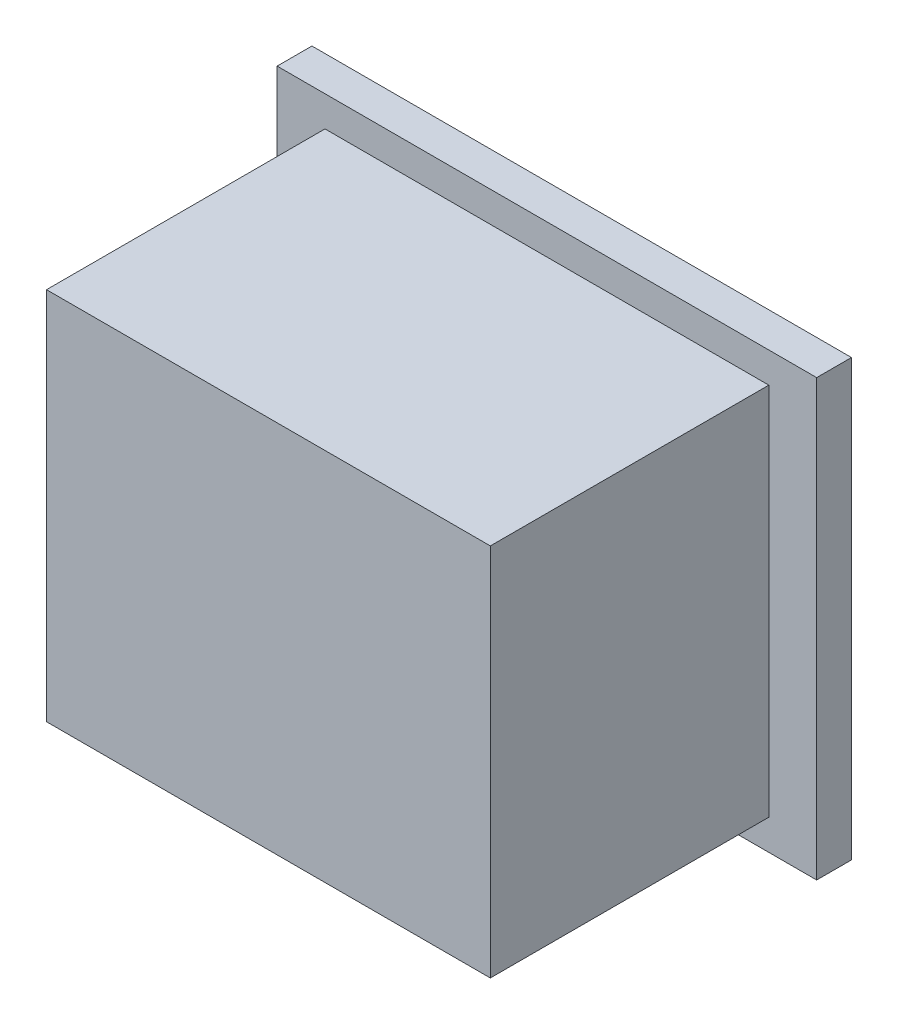
ISO-10303-21;
HEADER;
FILE_DESCRIPTION(('STEP AP214'),'2;1');
FILE_NAME('part.step','',(''),(''),'','','');
FILE_SCHEMA(('AUTOMOTIVE_DESIGN { 1 0 10303 214 1 1 1 1 }'));
ENDSEC;
DATA;
#1=APPLICATION_CONTEXT('core data for automotive mechanical design processes');
#2=APPLICATION_PROTOCOL_DEFINITION('international standard','automotive_design',2000,#1);
#3=PRODUCT_CONTEXT('',#1,'mechanical');
#4=PRODUCT('Part','Part','',(#3));
#5=PRODUCT_RELATED_PRODUCT_CATEGORY('part','',(#4));
#6=PRODUCT_DEFINITION_FORMATION('','',#4);
#7=PRODUCT_DEFINITION_CONTEXT('part definition',#1,'design');
#8=PRODUCT_DEFINITION('design','',#6,#7);
#9=PRODUCT_DEFINITION_SHAPE('','',#8);
#10=(LENGTH_UNIT() NAMED_UNIT(*) SI_UNIT(.MILLI.,.METRE.));
#11=(NAMED_UNIT(*) PLANE_ANGLE_UNIT() SI_UNIT($,.RADIAN.));
#12=(NAMED_UNIT(*) SI_UNIT($,.STERADIAN.) SOLID_ANGLE_UNIT());
#13=UNCERTAINTY_MEASURE_WITH_UNIT(LENGTH_MEASURE(1.E-05),#10,'distance_accuracy_value','');
#14=(GEOMETRIC_REPRESENTATION_CONTEXT(3) GLOBAL_UNCERTAINTY_ASSIGNED_CONTEXT((#13)) GLOBAL_UNIT_ASSIGNED_CONTEXT((#10,
#11,#12)) REPRESENTATION_CONTEXT('',''));
#15=CARTESIAN_POINT('',(0.,0.,0.));
#16=DIRECTION('',(0.,0.,1.));
#17=DIRECTION('',(1.,0.,0.));
#18=AXIS2_PLACEMENT_3D('',#15,#16,#17);
#19=CARTESIAN_POINT('',(-12.75,-10.75,16.));
#20=DIRECTION('',(1.,0.,0.));
#21=DIRECTION('',(0.,0.,-1.));
#22=AXIS2_PLACEMENT_3D('',#19,#20,#21);
#23=PLANE('',#22);
#24=DIRECTION('',(0.,-1.,0.));
#25=VECTOR('',#24,1.);
#26=CARTESIAN_POINT('',(-12.75,-10.75,0.));
#27=LINE('',#26,#25);
#28=CARTESIAN_POINT('',(-12.75,10.75,0.));
#29=VERTEX_POINT('',#28);
#30=CARTESIAN_POINT('',(-12.75,-10.75,0.));
#31=VERTEX_POINT('',#30);
#32=EDGE_CURVE('E118',#29,#31,#27,.T.);
#33=ORIENTED_EDGE('',*,*,#32,.T.);
#34=DIRECTION('',(0.,0.,-1.));
#35=VECTOR('',#34,1.);
#36=CARTESIAN_POINT('',(-12.75,-10.75,16.));
#37=LINE('',#36,#35);
#38=CARTESIAN_POINT('',(-12.75,-10.75,16.));
#39=VERTEX_POINT('',#38);
#40=EDGE_CURVE('E11',#39,#31,#37,.T.);
#41=ORIENTED_EDGE('',*,*,#40,.F.);
#42=DIRECTION('',(0.,-1.,0.));
#43=VECTOR('',#42,1.);
#44=CARTESIAN_POINT('',(-12.75,-10.75,16.));
#45=LINE('',#44,#43);
#46=CARTESIAN_POINT('',(-12.75,10.75,16.));
#47=VERTEX_POINT('',#46);
#48=EDGE_CURVE('E127',#47,#39,#45,.T.);
#49=ORIENTED_EDGE('',*,*,#48,.F.);
#50=DIRECTION('',(0.,0.,-1.));
#51=VECTOR('',#50,1.);
#52=CARTESIAN_POINT('',(-12.75,10.75,16.));
#53=LINE('',#52,#51);
#54=EDGE_CURVE('E134',#47,#29,#53,.T.);
#55=ORIENTED_EDGE('',*,*,#54,.T.);
#56=EDGE_LOOP('',(#33,#41,#49,#55));
#57=FACE_BOUND('',#56,.T.);
#58=ADVANCED_FACE('F33',(#57),#23,.F.);
#59=CARTESIAN_POINT('',(12.75,-10.75,16.));
#60=DIRECTION('',(0.,1.,0.));
#61=DIRECTION('',(-1.,0.,0.));
#62=AXIS2_PLACEMENT_3D('',#59,#60,#61);
#63=PLANE('',#62);
#64=DIRECTION('',(1.,0.,0.));
#65=VECTOR('',#64,1.);
#66=CARTESIAN_POINT('',(12.75,-10.75,0.));
#67=LINE('',#66,#65);
#68=CARTESIAN_POINT('',(12.75,-10.75,0.));
#69=VERTEX_POINT('',#68);
#70=EDGE_CURVE('E121',#31,#69,#67,.T.);
#71=ORIENTED_EDGE('',*,*,#70,.T.);
#72=DIRECTION('',(0.,0.,-1.));
#73=VECTOR('',#72,1.);
#74=CARTESIAN_POINT('',(12.75,-10.75,16.));
#75=LINE('',#74,#73);
#76=CARTESIAN_POINT('',(12.75,-10.75,16.));
#77=VERTEX_POINT('',#76);
#78=EDGE_CURVE('E41',#77,#69,#75,.T.);
#79=ORIENTED_EDGE('',*,*,#78,.F.);
#80=DIRECTION('',(1.,0.,0.));
#81=VECTOR('',#80,1.);
#82=CARTESIAN_POINT('',(12.75,-10.75,16.));
#83=LINE('',#82,#81);
#84=EDGE_CURVE('E129',#39,#77,#83,.T.);
#85=ORIENTED_EDGE('',*,*,#84,.F.);
#86=ORIENTED_EDGE('',*,*,#40,.T.);
#87=EDGE_LOOP('',(#71,#79,#85,#86));
#88=FACE_BOUND('',#87,.T.);
#89=ADVANCED_FACE('F155',(#88),#63,.F.);
#90=CARTESIAN_POINT('',(12.75,-10.75,16.));
#91=DIRECTION('',(-1.,0.,0.));
#92=DIRECTION('',(0.,0.,1.));
#93=AXIS2_PLACEMENT_3D('',#90,#91,#92);
#94=PLANE('',#93);
#95=DIRECTION('',(0.,1.,0.));
#96=VECTOR('',#95,1.);
#97=CARTESIAN_POINT('',(12.75,-10.75,0.));
#98=LINE('',#97,#96);
#99=CARTESIAN_POINT('',(12.75,10.75,0.));
#100=VERTEX_POINT('',#99);
#101=EDGE_CURVE('E138',#69,#100,#98,.T.);
#102=ORIENTED_EDGE('',*,*,#101,.T.);
#103=DIRECTION('',(0.,0.,-1.));
#104=VECTOR('',#103,1.);
#105=CARTESIAN_POINT('',(12.75,10.75,16.));
#106=LINE('',#105,#104);
#107=CARTESIAN_POINT('',(12.75,10.75,16.));
#108=VERTEX_POINT('',#107);
#109=EDGE_CURVE('E145',#108,#100,#106,.T.);
#110=ORIENTED_EDGE('',*,*,#109,.F.);
#111=DIRECTION('',(0.,1.,0.));
#112=VECTOR('',#111,1.);
#113=CARTESIAN_POINT('',(12.75,-10.75,16.));
#114=LINE('',#113,#112);
#115=EDGE_CURVE('E132',#77,#108,#114,.T.);
#116=ORIENTED_EDGE('',*,*,#115,.F.);
#117=ORIENTED_EDGE('',*,*,#78,.T.);
#118=EDGE_LOOP('',(#102,#110,#116,#117));
#119=FACE_BOUND('',#118,.T.);
#120=ADVANCED_FACE('F151',(#119),#94,.F.);
#121=CARTESIAN_POINT('',(12.75,10.75,16.));
#122=DIRECTION('',(0.,-1.,0.));
#123=DIRECTION('',(1.,0.,0.));
#124=AXIS2_PLACEMENT_3D('',#121,#122,#123);
#125=PLANE('',#124);
#126=DIRECTION('',(-1.,0.,0.));
#127=VECTOR('',#126,1.);
#128=CARTESIAN_POINT('',(12.75,10.75,0.));
#129=LINE('',#128,#127);
#130=EDGE_CURVE('E130',#100,#29,#129,.T.);
#131=ORIENTED_EDGE('',*,*,#130,.T.);
#132=ORIENTED_EDGE('',*,*,#54,.F.);
#133=DIRECTION('',(-1.,0.,0.));
#134=VECTOR('',#133,1.);
#135=CARTESIAN_POINT('',(12.75,10.75,16.));
#136=LINE('',#135,#134);
#137=EDGE_CURVE('E48',#108,#47,#136,.T.);
#138=ORIENTED_EDGE('',*,*,#137,.F.);
#139=ORIENTED_EDGE('',*,*,#109,.T.);
#140=EDGE_LOOP('',(#131,#132,#138,#139));
#141=FACE_BOUND('',#140,.T.);
#142=ADVANCED_FACE('F161',(#141),#125,.F.);
#143=CARTESIAN_POINT('',(0.,0.,16.));
#144=DIRECTION('',(0.,0.,1.));
#145=DIRECTION('',(1.,0.,0.));
#146=AXIS2_PLACEMENT_3D('',#143,#144,#145);
#147=PLANE('',#146);
#148=ORIENTED_EDGE('',*,*,#48,.T.);
#149=ORIENTED_EDGE('',*,*,#84,.T.);
#150=ORIENTED_EDGE('',*,*,#115,.T.);
#151=ORIENTED_EDGE('',*,*,#137,.T.);
#152=EDGE_LOOP('',(#148,#149,#150,#151));
#153=FACE_BOUND('',#152,.T.);
#154=ADVANCED_FACE('F164',(#153),#147,.T.);
#155=CARTESIAN_POINT('',(15.5,-12.5,-2.));
#156=DIRECTION('',(-1.,0.,0.));
#157=DIRECTION('',(0.,0.,1.));
#158=AXIS2_PLACEMENT_3D('',#155,#156,#157);
#159=PLANE('',#158);
#160=DIRECTION('',(0.,-1.,0.));
#161=VECTOR('',#160,1.);
#162=CARTESIAN_POINT('',(15.5,-12.5,0.));
#163=LINE('',#162,#161);
#164=CARTESIAN_POINT('',(15.5,12.5,0.));
#165=VERTEX_POINT('',#164);
#166=CARTESIAN_POINT('',(15.5,-12.5,0.));
#167=VERTEX_POINT('',#166);
#168=EDGE_CURVE('E117',#165,#167,#163,.T.);
#169=ORIENTED_EDGE('',*,*,#168,.T.);
#170=DIRECTION('',(0.,0.,1.));
#171=VECTOR('',#170,1.);
#172=CARTESIAN_POINT('',(15.5,-12.5,-2.));
#173=LINE('',#172,#171);
#174=CARTESIAN_POINT('',(15.5,-12.5,-2.));
#175=VERTEX_POINT('',#174);
#176=EDGE_CURVE('E97',#175,#167,#173,.T.);
#177=ORIENTED_EDGE('',*,*,#176,.F.);
#178=DIRECTION('',(0.,-1.,0.));
#179=VECTOR('',#178,1.);
#180=CARTESIAN_POINT('',(15.5,-12.5,-2.));
#181=LINE('',#180,#179);
#182=CARTESIAN_POINT('',(15.5,12.5,-2.));
#183=VERTEX_POINT('',#182);
#184=EDGE_CURVE('E104',#183,#175,#181,.T.);
#185=ORIENTED_EDGE('',*,*,#184,.F.);
#186=DIRECTION('',(0.,0.,1.));
#187=VECTOR('',#186,1.);
#188=CARTESIAN_POINT('',(15.5,12.5,-2.));
#189=LINE('',#188,#187);
#190=EDGE_CURVE('E244',#183,#165,#189,.T.);
#191=ORIENTED_EDGE('',*,*,#190,.T.);
#192=EDGE_LOOP('',(#169,#177,#185,#191));
#193=FACE_BOUND('',#192,.T.);
#194=ADVANCED_FACE('F115',(#193),#159,.F.);
#195=CARTESIAN_POINT('',(-15.5,-12.5,-2.));
#196=DIRECTION('',(0.,1.,0.));
#197=DIRECTION('',(-1.,0.,0.));
#198=AXIS2_PLACEMENT_3D('',#195,#196,#197);
#199=PLANE('',#198);
#200=DIRECTION('',(-1.,0.,0.));
#201=VECTOR('',#200,1.);
#202=CARTESIAN_POINT('',(-15.5,-12.5,0.));
#203=LINE('',#202,#201);
#204=CARTESIAN_POINT('',(-15.5,-12.5,0.));
#205=VERTEX_POINT('',#204);
#206=EDGE_CURVE('E250',#167,#205,#203,.T.);
#207=ORIENTED_EDGE('',*,*,#206,.T.);
#208=DIRECTION('',(0.,0.,1.));
#209=VECTOR('',#208,1.);
#210=CARTESIAN_POINT('',(-15.5,-12.5,-2.));
#211=LINE('',#210,#209);
#212=CARTESIAN_POINT('',(-15.5,-12.5,-2.));
#213=VERTEX_POINT('',#212);
#214=EDGE_CURVE('E100',#213,#205,#211,.T.);
#215=ORIENTED_EDGE('',*,*,#214,.F.);
#216=DIRECTION('',(-1.,0.,0.));
#217=VECTOR('',#216,1.);
#218=CARTESIAN_POINT('',(-15.5,-12.5,-2.));
#219=LINE('',#218,#217);
#220=EDGE_CURVE('E93',#175,#213,#219,.T.);
#221=ORIENTED_EDGE('',*,*,#220,.F.);
#222=ORIENTED_EDGE('',*,*,#176,.T.);
#223=EDGE_LOOP('',(#207,#215,#221,#222));
#224=FACE_BOUND('',#223,.T.);
#225=ADVANCED_FACE('F95',(#224),#199,.F.);
#226=CARTESIAN_POINT('',(-15.5,-12.5,-2.));
#227=DIRECTION('',(1.,0.,0.));
#228=DIRECTION('',(0.,1.,0.));
#229=AXIS2_PLACEMENT_3D('',#226,#227,#228);
#230=PLANE('',#229);
#231=DIRECTION('',(0.,1.,0.));
#232=VECTOR('',#231,1.);
#233=CARTESIAN_POINT('',(-15.5,-12.5,0.));
#234=LINE('',#233,#232);
#235=CARTESIAN_POINT('',(-15.5,12.5,0.));
#236=VERTEX_POINT('',#235);
#237=EDGE_CURVE('E247',#205,#236,#234,.T.);
#238=ORIENTED_EDGE('',*,*,#237,.T.);
#239=DIRECTION('',(0.,0.,1.));
#240=VECTOR('',#239,1.);
#241=CARTESIAN_POINT('',(-15.5,12.5,-2.));
#242=LINE('',#241,#240);
#243=CARTESIAN_POINT('',(-15.5,12.5,-2.));
#244=VERTEX_POINT('',#243);
#245=EDGE_CURVE('E123',#244,#236,#242,.T.);
#246=ORIENTED_EDGE('',*,*,#245,.F.);
#247=DIRECTION('',(0.,1.,0.));
#248=VECTOR('',#247,1.);
#249=CARTESIAN_POINT('',(-15.5,-12.5,-2.));
#250=LINE('',#249,#248);
#251=EDGE_CURVE('E103',#213,#244,#250,.T.);
#252=ORIENTED_EDGE('',*,*,#251,.F.);
#253=ORIENTED_EDGE('',*,*,#214,.T.);
#254=EDGE_LOOP('',(#238,#246,#252,#253));
#255=FACE_BOUND('',#254,.T.);
#256=ADVANCED_FACE('F203',(#255),#230,.F.);
#257=CARTESIAN_POINT('',(-15.5,12.5,-2.));
#258=DIRECTION('',(0.,-1.,0.));
#259=DIRECTION('',(1.,0.,0.));
#260=AXIS2_PLACEMENT_3D('',#257,#258,#259);
#261=PLANE('',#260);
#262=DIRECTION('',(1.,0.,0.));
#263=VECTOR('',#262,1.);
#264=CARTESIAN_POINT('',(-15.5,12.5,0.));
#265=LINE('',#264,#263);
#266=EDGE_CURVE('E113',#236,#165,#265,.T.);
#267=ORIENTED_EDGE('',*,*,#266,.T.);
#268=ORIENTED_EDGE('',*,*,#190,.F.);
#269=DIRECTION('',(1.,0.,0.));
#270=VECTOR('',#269,1.);
#271=CARTESIAN_POINT('',(-15.5,12.5,-2.));
#272=LINE('',#271,#270);
#273=EDGE_CURVE('E109',#244,#183,#272,.T.);
#274=ORIENTED_EDGE('',*,*,#273,.F.);
#275=ORIENTED_EDGE('',*,*,#245,.T.);
#276=EDGE_LOOP('',(#267,#268,#274,#275));
#277=FACE_BOUND('',#276,.T.);
#278=ADVANCED_FACE('F212',(#277),#261,.F.);
#279=CARTESIAN_POINT('',(0.,0.,-2.));
#280=DIRECTION('',(0.,0.,-1.));
#281=DIRECTION('',(-1.,0.,0.));
#282=AXIS2_PLACEMENT_3D('',#279,#280,#281);
#283=PLANE('',#282);
#284=ORIENTED_EDGE('',*,*,#184,.T.);
#285=ORIENTED_EDGE('',*,*,#220,.T.);
#286=ORIENTED_EDGE('',*,*,#251,.T.);
#287=ORIENTED_EDGE('',*,*,#273,.T.);
#288=EDGE_LOOP('',(#284,#285,#286,#287));
#289=FACE_BOUND('',#288,.T.);
#290=ADVANCED_FACE('F107',(#289),#283,.T.);
#291=CARTESIAN_POINT('',(0.,0.,0.));
#292=DIRECTION('',(0.,0.,-1.));
#293=DIRECTION('',(-1.,0.,0.));
#294=AXIS2_PLACEMENT_3D('',#291,#292,#293);
#295=PLANE('',#294);
#296=ORIENTED_EDGE('',*,*,#32,.F.);
#297=ORIENTED_EDGE('',*,*,#130,.F.);
#298=ORIENTED_EDGE('',*,*,#101,.F.);
#299=ORIENTED_EDGE('',*,*,#70,.F.);
#300=EDGE_LOOP('',(#296,#297,#298,#299));
#301=FACE_BOUND('',#300,.T.);
#302=ORIENTED_EDGE('',*,*,#168,.F.);
#303=ORIENTED_EDGE('',*,*,#266,.F.);
#304=ORIENTED_EDGE('',*,*,#237,.F.);
#305=ORIENTED_EDGE('',*,*,#206,.F.);
#306=EDGE_LOOP('',(#302,#303,#304,#305));
#307=FACE_BOUND('',#306,.T.);
#308=ADVANCED_FACE('F158',(#301,#307),#295,.F.);
#309=CLOSED_SHELL('',(#58,#89,#120,#142,#154,#194,#225,#256,#278,#290,#308));
#310=MANIFOLD_SOLID_BREP('B2',#309);
#311=ADVANCED_BREP_SHAPE_REPRESENTATION('',(#18,#310),#14);
#312=SHAPE_DEFINITION_REPRESENTATION(#9,#311);
ENDSEC;
END-ISO-10303-21;
